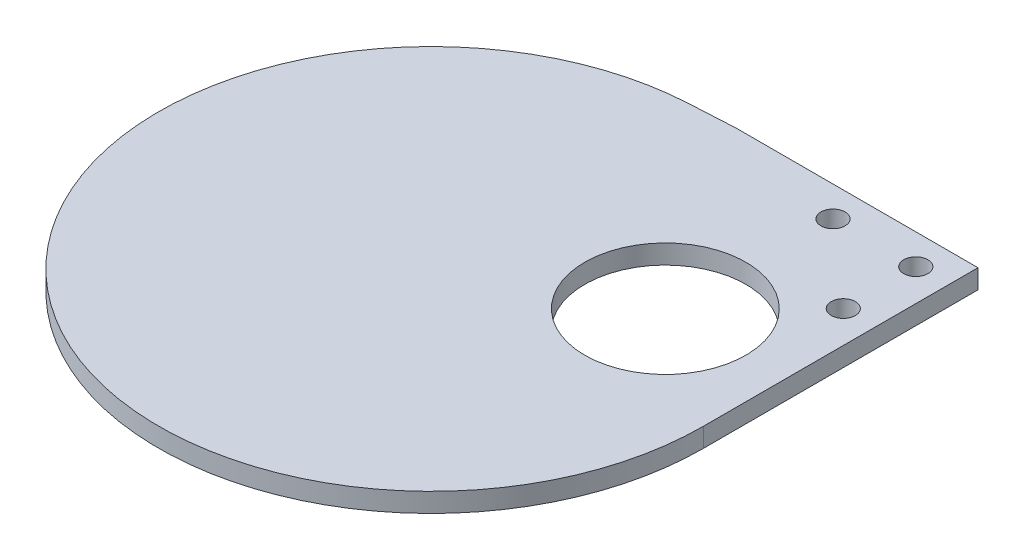
ISO-10303-21;
HEADER;
FILE_DESCRIPTION(('STEP AP214'),'2;1');
FILE_NAME('part.step','',(''),(''),'','','');
FILE_SCHEMA(('AUTOMOTIVE_DESIGN { 1 0 10303 214 1 1 1 1 }'));
ENDSEC;
DATA;
#1=APPLICATION_CONTEXT('core data for automotive mechanical design processes');
#2=APPLICATION_PROTOCOL_DEFINITION('international standard','automotive_design',2000,#1);
#3=PRODUCT_CONTEXT('',#1,'mechanical');
#4=PRODUCT('Part','Part','',(#3));
#5=PRODUCT_RELATED_PRODUCT_CATEGORY('part','',(#4));
#6=PRODUCT_DEFINITION_FORMATION('','',#4);
#7=PRODUCT_DEFINITION_CONTEXT('part definition',#1,'design');
#8=PRODUCT_DEFINITION('design','',#6,#7);
#9=PRODUCT_DEFINITION_SHAPE('','',#8);
#10=(LENGTH_UNIT() NAMED_UNIT(*) SI_UNIT(.MILLI.,.METRE.));
#11=(NAMED_UNIT(*) PLANE_ANGLE_UNIT() SI_UNIT($,.RADIAN.));
#12=(NAMED_UNIT(*) SI_UNIT($,.STERADIAN.) SOLID_ANGLE_UNIT());
#13=UNCERTAINTY_MEASURE_WITH_UNIT(LENGTH_MEASURE(1.E-05),#10,'distance_accuracy_value','');
#14=(GEOMETRIC_REPRESENTATION_CONTEXT(3) GLOBAL_UNCERTAINTY_ASSIGNED_CONTEXT((#13)) GLOBAL_UNIT_ASSIGNED_CONTEXT((#10,
#11,#12)) REPRESENTATION_CONTEXT('',''));
#15=CARTESIAN_POINT('',(0.,0.,0.));
#16=DIRECTION('',(0.,0.,1.));
#17=DIRECTION('',(1.,0.,0.));
#18=AXIS2_PLACEMENT_3D('',#15,#16,#17);
#19=CARTESIAN_POINT('',(-1.81007440725672,3.175,-32.7551879075554));
#20=DIRECTION('',(0.0551765104801048,0.,0.998476615996208));
#21=DIRECTION('',(0.998476615996208,0.,-0.0551765104801048));
#22=AXIS2_PLACEMENT_3D('',#19,#20,#21);
#23=PLANE('',#22);
#24=DIRECTION('',(-0.998476615996208,0.,0.0551765104801048));
#25=VECTOR('',#24,1.);
#26=CARTESIAN_POINT('',(-1.81007440725672,0.,-32.7551879075554));
#27=LINE('',#26,#25);
#28=CARTESIAN_POINT('',(-20.000000005,0.,-31.75));
#29=VERTEX_POINT('',#28);
#30=CARTESIAN_POINT('',(-27.5726329699955,0.,-31.3315310489388));
#31=VERTEX_POINT('',#30);
#32=EDGE_CURVE('E121',#29,#31,#27,.T.);
#33=ORIENTED_EDGE('',*,*,#32,.T.);
#34=DIRECTION('',(0.,-1.,0.));
#35=VECTOR('',#34,1.);
#36=CARTESIAN_POINT('',(-27.5726329699955,3.175,-31.3315310489388));
#37=LINE('',#36,#35);
#38=CARTESIAN_POINT('',(-27.5726329699955,3.175,-31.3315310489388));
#39=VERTEX_POINT('',#38);
#40=EDGE_CURVE('E11',#39,#31,#37,.T.);
#41=ORIENTED_EDGE('',*,*,#40,.F.);
#42=DIRECTION('',(-0.998476615996208,0.,0.0551765104801048));
#43=VECTOR('',#42,1.);
#44=CARTESIAN_POINT('',(-1.81007440725672,3.175,-32.7551879075554));
#45=LINE('',#44,#43);
#46=CARTESIAN_POINT('',(-20.000000005,3.175,-31.75));
#47=VERTEX_POINT('',#46);
#48=EDGE_CURVE('E98',#47,#39,#45,.T.);
#49=ORIENTED_EDGE('',*,*,#48,.F.);
#50=DIRECTION('',(0.,-1.,0.));
#51=VECTOR('',#50,1.);
#52=CARTESIAN_POINT('',(-20.000000005,3.175,-31.75));
#53=LINE('',#52,#51);
#54=EDGE_CURVE('E113',#47,#29,#53,.T.);
#55=ORIENTED_EDGE('',*,*,#54,.T.);
#56=EDGE_LOOP('',(#33,#41,#49,#55));
#57=FACE_BOUND('',#56,.T.);
#58=ADVANCED_FACE('F41',(#57),#23,.F.);
#59=CARTESIAN_POINT('',(-25.084999995,3.175,13.6847871832502));
#60=DIRECTION('',(0.,-1.,0.));
#61=DIRECTION('',(0.,0.,-1.));
#62=AXIS2_PLACEMENT_3D('',#59,#60,#61);
#63=CYLINDRICAL_SURFACE('',#62,45.085);
#64=CARTESIAN_POINT('',(-25.084999995,0.,13.6847871832502));
#65=DIRECTION('',(0.,1.,0.));
#66=DIRECTION('',(0.,0.,1.));
#67=AXIS2_PLACEMENT_3D('',#64,#65,#66);
#68=CIRCLE('',#67,45.085);
#69=CARTESIAN_POINT('',(20.000000005,0.,13.6847871832502));
#70=VERTEX_POINT('',#69);
#71=EDGE_CURVE('E104',#31,#70,#68,.T.);
#72=ORIENTED_EDGE('',*,*,#71,.T.);
#73=DIRECTION('',(0.,-1.,0.));
#74=VECTOR('',#73,1.);
#75=CARTESIAN_POINT('',(20.000000005,3.175,13.6847871832502));
#76=LINE('',#75,#74);
#77=CARTESIAN_POINT('',(20.000000005,3.175,13.6847871832502));
#78=VERTEX_POINT('',#77);
#79=EDGE_CURVE('E51',#78,#70,#76,.T.);
#80=ORIENTED_EDGE('',*,*,#79,.F.);
#81=CARTESIAN_POINT('',(-25.084999995,3.175,13.6847871832502));
#82=DIRECTION('',(0.,1.,0.));
#83=DIRECTION('',(0.,0.,1.));
#84=AXIS2_PLACEMENT_3D('',#81,#82,#83);
#85=CIRCLE('',#84,45.085);
#86=EDGE_CURVE('E93',#39,#78,#85,.T.);
#87=ORIENTED_EDGE('',*,*,#86,.F.);
#88=ORIENTED_EDGE('',*,*,#40,.T.);
#89=EDGE_LOOP('',(#72,#80,#87,#88));
#90=FACE_BOUND('',#89,.T.);
#91=ADVANCED_FACE('F103',(#90),#63,.T.);
#92=CARTESIAN_POINT('',(20.000000005,3.175,0.));
#93=DIRECTION('',(1.,0.,0.));
#94=DIRECTION('',(0.,0.,-1.));
#95=AXIS2_PLACEMENT_3D('',#92,#93,#94);
#96=PLANE('',#95);
#97=DIRECTION('',(0.,0.,1.));
#98=VECTOR('',#97,1.);
#99=CARTESIAN_POINT('',(20.000000005,0.,0.));
#100=LINE('',#99,#98);
#101=CARTESIAN_POINT('',(20.000000005,0.,-31.75));
#102=VERTEX_POINT('',#101);
#103=EDGE_CURVE('E128',#102,#70,#100,.T.);
#104=ORIENTED_EDGE('',*,*,#103,.F.);
#105=DIRECTION('',(0.,-1.,0.));
#106=VECTOR('',#105,1.);
#107=CARTESIAN_POINT('',(20.000000005,3.175,-31.75));
#108=LINE('',#107,#106);
#109=CARTESIAN_POINT('',(20.000000005,3.175,-31.75));
#110=VERTEX_POINT('',#109);
#111=EDGE_CURVE('E82',#110,#102,#108,.T.);
#112=ORIENTED_EDGE('',*,*,#111,.F.);
#113=DIRECTION('',(0.,0.,1.));
#114=VECTOR('',#113,1.);
#115=CARTESIAN_POINT('',(20.000000005,3.175,0.));
#116=LINE('',#115,#114);
#117=EDGE_CURVE('E96',#110,#78,#116,.T.);
#118=ORIENTED_EDGE('',*,*,#117,.T.);
#119=ORIENTED_EDGE('',*,*,#79,.T.);
#120=EDGE_LOOP('',(#104,#112,#118,#119));
#121=FACE_BOUND('',#120,.T.);
#122=ADVANCED_FACE('F109',(#121),#96,.T.);
#123=CARTESIAN_POINT('',(0.,3.175,0.));
#124=DIRECTION('',(0.,-1.,0.));
#125=DIRECTION('',(0.,0.,-1.));
#126=AXIS2_PLACEMENT_3D('',#123,#124,#125);
#127=CYLINDRICAL_SURFACE('',#126,13.335);
#128=CARTESIAN_POINT('',(0.,3.175,0.));
#129=DIRECTION('',(0.,1.,0.));
#130=DIRECTION('',(0.,0.,1.));
#131=AXIS2_PLACEMENT_3D('',#128,#129,#130);
#132=CIRCLE('',#131,13.335);
#133=CARTESIAN_POINT('',(0.,3.175,13.335));
#134=VERTEX_POINT('',#133);
#135=EDGE_CURVE('E133',#134,#134,#132,.T.);
#136=ORIENTED_EDGE('',*,*,#135,.T.);
#137=EDGE_LOOP('',(#136));
#138=FACE_BOUND('',#137,.T.);
#139=CARTESIAN_POINT('',(0.,0.,0.));
#140=DIRECTION('',(0.,1.,0.));
#141=DIRECTION('',(0.,0.,1.));
#142=AXIS2_PLACEMENT_3D('',#139,#140,#141);
#143=CIRCLE('',#142,13.335);
#144=CARTESIAN_POINT('',(0.,0.,13.335));
#145=VERTEX_POINT('',#144);
#146=EDGE_CURVE('E117',#145,#145,#143,.T.);
#147=ORIENTED_EDGE('',*,*,#146,.F.);
#148=EDGE_LOOP('',(#147));
#149=FACE_BOUND('',#148,.T.);
#150=ADVANCED_FACE('F43',(#138,#149),#127,.F.);
#151=CARTESIAN_POINT('',(0.,3.175,-31.75));
#152=DIRECTION('',(0.,0.,1.));
#153=DIRECTION('',(1.,0.,0.));
#154=AXIS2_PLACEMENT_3D('',#151,#152,#153);
#155=PLANE('',#154);
#156=DIRECTION('',(-1.,0.,0.));
#157=VECTOR('',#156,1.);
#158=CARTESIAN_POINT('',(0.,0.,-31.75));
#159=LINE('',#158,#157);
#160=EDGE_CURVE('E86',#102,#29,#159,.T.);
#161=ORIENTED_EDGE('',*,*,#160,.T.);
#162=ORIENTED_EDGE('',*,*,#54,.F.);
#163=DIRECTION('',(-1.,0.,0.));
#164=VECTOR('',#163,1.);
#165=CARTESIAN_POINT('',(0.,3.175,-31.75));
#166=LINE('',#165,#164);
#167=EDGE_CURVE('E62',#110,#47,#166,.T.);
#168=ORIENTED_EDGE('',*,*,#167,.F.);
#169=ORIENTED_EDGE('',*,*,#111,.T.);
#170=EDGE_LOOP('',(#161,#162,#168,#169));
#171=FACE_BOUND('',#170,.T.);
#172=ADVANCED_FACE('F181',(#171),#155,.F.);
#173=CARTESIAN_POINT('',(0.,3.175,0.));
#174=DIRECTION('',(0.,1.,0.));
#175=DIRECTION('',(0.,0.,1.));
#176=AXIS2_PLACEMENT_3D('',#173,#174,#175);
#177=PLANE('',#176);
#178=CARTESIAN_POINT('',(14.7060064331574,3.175,-14.7499999999999));
#179=DIRECTION('',(0.,1.,0.));
#180=DIRECTION('',(0.,0.,1.));
#181=AXIS2_PLACEMENT_3D('',#178,#179,#180);
#182=CIRCLE('',#181,2.);
#183=CARTESIAN_POINT('',(14.7060064331574,3.175,-12.7499999999999));
#184=VERTEX_POINT('',#183);
#185=EDGE_CURVE('E158',#184,#184,#182,.F.);
#186=ORIENTED_EDGE('',*,*,#185,.T.);
#187=EDGE_LOOP('',(#186));
#188=FACE_BOUND('',#187,.T.);
#189=CARTESIAN_POINT('',(14.7060064331574,3.175,-26.7499999999999));
#190=DIRECTION('',(0.,1.,0.));
#191=DIRECTION('',(0.,0.,1.));
#192=AXIS2_PLACEMENT_3D('',#189,#190,#191);
#193=CIRCLE('',#192,2.);
#194=CARTESIAN_POINT('',(14.7060064331574,3.175,-24.7499999999999));
#195=VERTEX_POINT('',#194);
#196=EDGE_CURVE('E141',#195,#195,#193,.F.);
#197=ORIENTED_EDGE('',*,*,#196,.T.);
#198=EDGE_LOOP('',(#197));
#199=FACE_BOUND('',#198,.T.);
#200=CARTESIAN_POINT('',(1.00000000000008,3.175,-26.7499999999999));
#201=DIRECTION('',(0.,1.,0.));
#202=DIRECTION('',(0.,0.,1.));
#203=AXIS2_PLACEMENT_3D('',#200,#201,#202);
#204=CIRCLE('',#203,2.);
#205=CARTESIAN_POINT('',(1.00000000000008,3.175,-24.7499999999999));
#206=VERTEX_POINT('',#205);
#207=EDGE_CURVE('E142',#206,#206,#204,.F.);
#208=ORIENTED_EDGE('',*,*,#207,.T.);
#209=EDGE_LOOP('',(#208));
#210=FACE_BOUND('',#209,.T.);
#211=ORIENTED_EDGE('',*,*,#135,.F.);
#212=EDGE_LOOP('',(#211));
#213=FACE_BOUND('',#212,.T.);
#214=ORIENTED_EDGE('',*,*,#48,.T.);
#215=ORIENTED_EDGE('',*,*,#86,.T.);
#216=ORIENTED_EDGE('',*,*,#117,.F.);
#217=ORIENTED_EDGE('',*,*,#167,.T.);
#218=EDGE_LOOP('',(#214,#215,#216,#217));
#219=FACE_BOUND('',#218,.T.);
#220=ADVANCED_FACE('F94',(#188,#199,#210,#213,#219),#177,.T.);
#221=CARTESIAN_POINT('',(0.,0.,0.));
#222=DIRECTION('',(0.,1.,0.));
#223=DIRECTION('',(0.,0.,1.));
#224=AXIS2_PLACEMENT_3D('',#221,#222,#223);
#225=PLANE('',#224);
#226=CARTESIAN_POINT('',(14.7060064331574,0.,-14.7499999999999));
#227=DIRECTION('',(0.,-1.,0.));
#228=DIRECTION('',(0.,0.,-1.));
#229=AXIS2_PLACEMENT_3D('',#226,#227,#228);
#230=CIRCLE('',#229,2.);
#231=CARTESIAN_POINT('',(14.7060064331574,0.,-16.7499999999999));
#232=VERTEX_POINT('',#231);
#233=EDGE_CURVE('E122',#232,#232,#230,.T.);
#234=ORIENTED_EDGE('',*,*,#233,.F.);
#235=EDGE_LOOP('',(#234));
#236=FACE_BOUND('',#235,.T.);
#237=CARTESIAN_POINT('',(14.7060064331574,0.,-26.7499999999999));
#238=DIRECTION('',(0.,-1.,0.));
#239=DIRECTION('',(0.,0.,-1.));
#240=AXIS2_PLACEMENT_3D('',#237,#238,#239);
#241=CIRCLE('',#240,2.);
#242=CARTESIAN_POINT('',(14.7060064331574,0.,-28.7499999999999));
#243=VERTEX_POINT('',#242);
#244=EDGE_CURVE('E154',#243,#243,#241,.T.);
#245=ORIENTED_EDGE('',*,*,#244,.F.);
#246=EDGE_LOOP('',(#245));
#247=FACE_BOUND('',#246,.T.);
#248=CARTESIAN_POINT('',(1.00000000000008,0.,-26.7499999999999));
#249=DIRECTION('',(0.,-1.,0.));
#250=DIRECTION('',(0.,0.,-1.));
#251=AXIS2_PLACEMENT_3D('',#248,#249,#250);
#252=CIRCLE('',#251,2.);
#253=CARTESIAN_POINT('',(1.00000000000008,0.,-28.7499999999999));
#254=VERTEX_POINT('',#253);
#255=EDGE_CURVE('E138',#254,#254,#252,.T.);
#256=ORIENTED_EDGE('',*,*,#255,.F.);
#257=EDGE_LOOP('',(#256));
#258=FACE_BOUND('',#257,.T.);
#259=ORIENTED_EDGE('',*,*,#146,.T.);
#260=EDGE_LOOP('',(#259));
#261=FACE_BOUND('',#260,.T.);
#262=ORIENTED_EDGE('',*,*,#32,.F.);
#263=ORIENTED_EDGE('',*,*,#160,.F.);
#264=ORIENTED_EDGE('',*,*,#103,.T.);
#265=ORIENTED_EDGE('',*,*,#71,.F.);
#266=EDGE_LOOP('',(#262,#263,#264,#265));
#267=FACE_BOUND('',#266,.T.);
#268=ADVANCED_FACE('F168',(#236,#247,#258,#261,#267),#225,.F.);
#269=CARTESIAN_POINT('',(1.00000000000008,3.176,-26.7499999999999));
#270=DIRECTION('',(0.,-1.,0.));
#271=DIRECTION('',(0.,0.,-1.));
#272=AXIS2_PLACEMENT_3D('',#269,#270,#271);
#273=CYLINDRICAL_SURFACE('',#272,2.);
#274=ORIENTED_EDGE('',*,*,#207,.F.);
#275=EDGE_LOOP('',(#274));
#276=FACE_BOUND('',#275,.T.);
#277=ORIENTED_EDGE('',*,*,#255,.T.);
#278=EDGE_LOOP('',(#277));
#279=FACE_BOUND('',#278,.T.);
#280=ADVANCED_FACE('F171',(#276,#279),#273,.F.);
#281=CARTESIAN_POINT('',(14.7060064331574,3.176,-26.7499999999999));
#282=DIRECTION('',(0.,-1.,0.));
#283=DIRECTION('',(0.,0.,-1.));
#284=AXIS2_PLACEMENT_3D('',#281,#282,#283);
#285=CYLINDRICAL_SURFACE('',#284,2.);
#286=ORIENTED_EDGE('',*,*,#196,.F.);
#287=EDGE_LOOP('',(#286));
#288=FACE_BOUND('',#287,.T.);
#289=ORIENTED_EDGE('',*,*,#244,.T.);
#290=EDGE_LOOP('',(#289));
#291=FACE_BOUND('',#290,.T.);
#292=ADVANCED_FACE('F220',(#288,#291),#285,.F.);
#293=CARTESIAN_POINT('',(14.7060064331574,3.176,-14.7499999999999));
#294=DIRECTION('',(0.,-1.,0.));
#295=DIRECTION('',(0.,0.,-1.));
#296=AXIS2_PLACEMENT_3D('',#293,#294,#295);
#297=CYLINDRICAL_SURFACE('',#296,2.);
#298=ORIENTED_EDGE('',*,*,#185,.F.);
#299=EDGE_LOOP('',(#298));
#300=FACE_BOUND('',#299,.T.);
#301=ORIENTED_EDGE('',*,*,#233,.T.);
#302=EDGE_LOOP('',(#301));
#303=FACE_BOUND('',#302,.T.);
#304=ADVANCED_FACE('F166',(#300,#303),#297,.F.);
#305=CLOSED_SHELL('',(#58,#91,#122,#150,#172,#220,#268,#280,#292,#304));
#306=MANIFOLD_SOLID_BREP('B2',#305);
#307=ADVANCED_BREP_SHAPE_REPRESENTATION('',(#18,#306),#14);
#308=SHAPE_DEFINITION_REPRESENTATION(#9,#307);
ENDSEC;
END-ISO-10303-21;
